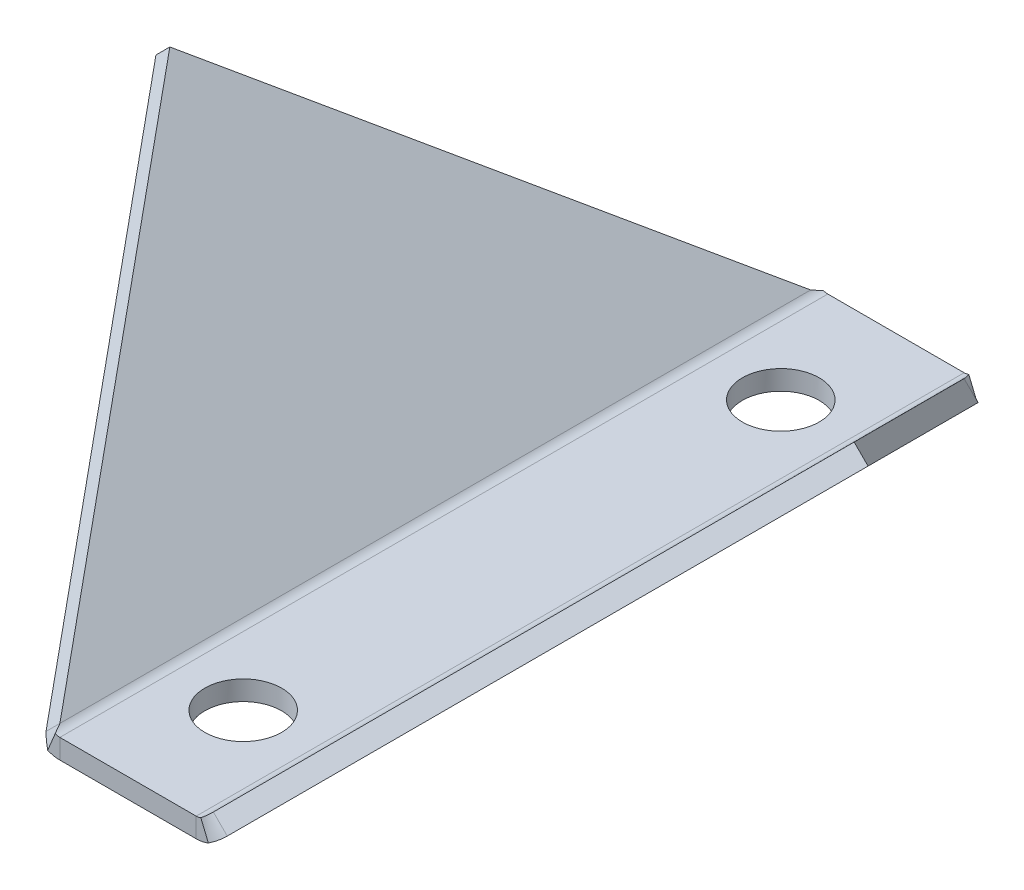
ISO-10303-21;
HEADER;
FILE_DESCRIPTION(('STEP AP214'),'2;1');
FILE_NAME('part.step','',(''),(''),'','','');
FILE_SCHEMA(('AUTOMOTIVE_DESIGN { 1 0 10303 214 1 1 1 1 }'));
ENDSEC;
DATA;
#1=APPLICATION_CONTEXT('core data for automotive mechanical design processes');
#2=APPLICATION_PROTOCOL_DEFINITION('international standard','automotive_design',2000,#1);
#3=PRODUCT_CONTEXT('',#1,'mechanical');
#4=PRODUCT('Part','Part','',(#3));
#5=PRODUCT_RELATED_PRODUCT_CATEGORY('part','',(#4));
#6=PRODUCT_DEFINITION_FORMATION('','',#4);
#7=PRODUCT_DEFINITION_CONTEXT('part definition',#1,'design');
#8=PRODUCT_DEFINITION('design','',#6,#7);
#9=PRODUCT_DEFINITION_SHAPE('','',#8);
#10=(LENGTH_UNIT() NAMED_UNIT(*) SI_UNIT(.MILLI.,.METRE.));
#11=(NAMED_UNIT(*) PLANE_ANGLE_UNIT() SI_UNIT($,.RADIAN.));
#12=(NAMED_UNIT(*) SI_UNIT($,.STERADIAN.) SOLID_ANGLE_UNIT());
#13=UNCERTAINTY_MEASURE_WITH_UNIT(LENGTH_MEASURE(1.E-05),#10,'distance_accuracy_value','');
#14=(GEOMETRIC_REPRESENTATION_CONTEXT(3) GLOBAL_UNCERTAINTY_ASSIGNED_CONTEXT((#13)) GLOBAL_UNIT_ASSIGNED_CONTEXT((#10,
#11,#12)) REPRESENTATION_CONTEXT('',''));
#15=CARTESIAN_POINT('',(0.,0.,0.));
#16=DIRECTION('',(0.,0.,1.));
#17=DIRECTION('',(1.,0.,0.));
#18=AXIS2_PLACEMENT_3D('',#15,#16,#17);
#19=CARTESIAN_POINT('',(-6.35,-1.6256,-31.75));
#20=DIRECTION('',(0.,0.,-1.));
#21=DIRECTION('',(-1.,0.,0.));
#22=AXIS2_PLACEMENT_3D('',#19,#20,#21);
#23=PLANE('',#22);
#24=DIRECTION('',(-1.,0.,0.));
#25=VECTOR('',#24,1.);
#26=CARTESIAN_POINT('',(-6.35,0.,-31.75));
#27=LINE('',#26,#25);
#28=CARTESIAN_POINT('',(5.63811510469655,0.,-31.75));
#29=VERTEX_POINT('',#28);
#30=CARTESIAN_POINT('',(-5.63811510469655,0.,-31.75));
#31=VERTEX_POINT('',#30);
#32=EDGE_CURVE('E103',#29,#31,#27,.T.);
#33=ORIENTED_EDGE('',*,*,#32,.F.);
#34=DIRECTION('',(0.,-1.,0.));
#35=VECTOR('',#34,1.);
#36=CARTESIAN_POINT('',(5.63811510469655,-1.6256,-31.75));
#37=LINE('',#36,#35);
#38=CARTESIAN_POINT('',(5.63811510469655,-1.6256,-31.75));
#39=VERTEX_POINT('',#38);
#40=EDGE_CURVE('E596',#29,#39,#37,.T.);
#41=ORIENTED_EDGE('',*,*,#40,.T.);
#42=DIRECTION('',(-1.,0.,0.));
#43=VECTOR('',#42,1.);
#44=CARTESIAN_POINT('',(-6.35,-1.6256,-31.75));
#45=LINE('',#44,#43);
#46=CARTESIAN_POINT('',(-5.63811510469655,-1.6256,-31.75));
#47=VERTEX_POINT('',#46);
#48=EDGE_CURVE('E655',#39,#47,#45,.T.);
#49=ORIENTED_EDGE('',*,*,#48,.T.);
#50=DIRECTION('',(0.,-1.,0.));
#51=VECTOR('',#50,1.);
#52=CARTESIAN_POINT('',(-5.63811510469655,-1.6256,-31.75));
#53=LINE('',#52,#51);
#54=EDGE_CURVE('E589',#31,#47,#53,.T.);
#55=ORIENTED_EDGE('',*,*,#54,.F.);
#56=EDGE_LOOP('',(#33,#41,#49,#55));
#57=FACE_BOUND('',#56,.T.);
#58=ADVANCED_FACE('F76',(#57),#23,.T.);
#59=CARTESIAN_POINT('',(-6.35,-1.6256,31.75));
#60=DIRECTION('',(0.,0.,1.));
#61=DIRECTION('',(1.,0.,0.));
#62=AXIS2_PLACEMENT_3D('',#59,#60,#61);
#63=PLANE('',#62);
#64=DIRECTION('',(1.,0.,0.));
#65=VECTOR('',#64,1.);
#66=CARTESIAN_POINT('',(-6.35,-1.6256,31.75));
#67=LINE('',#66,#65);
#68=CARTESIAN_POINT('',(-5.63811510469655,-1.6256,31.75));
#69=VERTEX_POINT('',#68);
#70=CARTESIAN_POINT('',(5.63811510469655,-1.6256,31.75));
#71=VERTEX_POINT('',#70);
#72=EDGE_CURVE('E651',#69,#71,#67,.T.);
#73=ORIENTED_EDGE('',*,*,#72,.T.);
#74=DIRECTION('',(0.,1.,0.));
#75=VECTOR('',#74,1.);
#76=CARTESIAN_POINT('',(5.63811510469655,-1.6256,31.75));
#77=LINE('',#76,#75);
#78=CARTESIAN_POINT('',(5.63811510469655,0.,31.75));
#79=VERTEX_POINT('',#78);
#80=EDGE_CURVE('E12',#71,#79,#77,.T.);
#81=ORIENTED_EDGE('',*,*,#80,.T.);
#82=DIRECTION('',(1.,0.,0.));
#83=VECTOR('',#82,1.);
#84=CARTESIAN_POINT('',(-6.35,0.,31.75));
#85=LINE('',#84,#83);
#86=CARTESIAN_POINT('',(-5.63811510469655,0.,31.75));
#87=VERTEX_POINT('',#86);
#88=EDGE_CURVE('E644',#87,#79,#85,.T.);
#89=ORIENTED_EDGE('',*,*,#88,.F.);
#90=DIRECTION('',(0.,1.,0.));
#91=VECTOR('',#90,1.);
#92=CARTESIAN_POINT('',(-5.63811510469655,-1.6256,31.75));
#93=LINE('',#92,#91);
#94=EDGE_CURVE('E598',#69,#87,#93,.T.);
#95=ORIENTED_EDGE('',*,*,#94,.F.);
#96=EDGE_LOOP('',(#73,#81,#89,#95));
#97=FACE_BOUND('',#96,.T.);
#98=ADVANCED_FACE('F637',(#97),#63,.T.);
#99=CARTESIAN_POINT('',(0.,-1.6256,0.));
#100=DIRECTION('',(0.,-1.,0.));
#101=DIRECTION('',(0.,0.,-1.));
#102=AXIS2_PLACEMENT_3D('',#99,#100,#101);
#103=PLANE('',#102);
#104=CARTESIAN_POINT('',(0.,-1.6256,-22.225));
#105=DIRECTION('',(0.,-1.,0.));
#106=DIRECTION('',(0.,0.,-1.));
#107=AXIS2_PLACEMENT_3D('',#104,#105,#106);
#108=CIRCLE('',#107,3.175);
#109=CARTESIAN_POINT('',(0.,-1.6256,-25.4));
#110=VERTEX_POINT('',#109);
#111=EDGE_CURVE('E659',#110,#110,#108,.T.);
#112=ORIENTED_EDGE('',*,*,#111,.F.);
#113=EDGE_LOOP('',(#112));
#114=FACE_BOUND('',#113,.T.);
#115=CARTESIAN_POINT('',(0.,-1.6256,22.225));
#116=DIRECTION('',(0.,-1.,0.));
#117=DIRECTION('',(0.,0.,-1.));
#118=AXIS2_PLACEMENT_3D('',#115,#116,#117);
#119=CIRCLE('',#118,3.175);
#120=CARTESIAN_POINT('',(0.,-1.6256,19.05));
#121=VERTEX_POINT('',#120);
#122=EDGE_CURVE('E661',#121,#121,#119,.T.);
#123=ORIENTED_EDGE('',*,*,#122,.F.);
#124=EDGE_LOOP('',(#123));
#125=FACE_BOUND('',#124,.T.);
#126=ORIENTED_EDGE('',*,*,#48,.F.);
#127=DIRECTION('',(0.,0.,1.));
#128=VECTOR('',#127,1.);
#129=CARTESIAN_POINT('',(5.63811510469655,-1.6256,0.));
#130=LINE('',#129,#128);
#131=EDGE_CURVE('E592',#39,#71,#130,.T.);
#132=ORIENTED_EDGE('',*,*,#131,.T.);
#133=ORIENTED_EDGE('',*,*,#72,.F.);
#134=DIRECTION('',(0.,0.,1.));
#135=VECTOR('',#134,1.);
#136=CARTESIAN_POINT('',(-5.63811510469655,-1.6256,0.));
#137=LINE('',#136,#135);
#138=EDGE_CURVE('E654',#47,#69,#137,.T.);
#139=ORIENTED_EDGE('',*,*,#138,.F.);
#140=EDGE_LOOP('',(#126,#132,#133,#139));
#141=FACE_BOUND('',#140,.T.);
#142=ADVANCED_FACE('F641',(#114,#125,#141),#103,.T.);
#143=CARTESIAN_POINT('',(0.,0.,0.));
#144=DIRECTION('',(0.,-1.,0.));
#145=DIRECTION('',(0.,0.,-1.));
#146=AXIS2_PLACEMENT_3D('',#143,#144,#145);
#147=PLANE('',#146);
#148=CARTESIAN_POINT('',(0.,0.,-22.225));
#149=DIRECTION('',(0.,1.,0.));
#150=DIRECTION('',(0.,0.,1.));
#151=AXIS2_PLACEMENT_3D('',#148,#149,#150);
#152=CIRCLE('',#151,3.175);
#153=CARTESIAN_POINT('',(0.,0.,-19.05));
#154=VERTEX_POINT('',#153);
#155=EDGE_CURVE('E665',#154,#154,#152,.T.);
#156=ORIENTED_EDGE('',*,*,#155,.F.);
#157=EDGE_LOOP('',(#156));
#158=FACE_BOUND('',#157,.T.);
#159=CARTESIAN_POINT('',(0.,0.,22.225));
#160=DIRECTION('',(0.,1.,0.));
#161=DIRECTION('',(0.,0.,1.));
#162=AXIS2_PLACEMENT_3D('',#159,#160,#161);
#163=CIRCLE('',#162,3.175);
#164=CARTESIAN_POINT('',(0.,0.,25.4));
#165=VERTEX_POINT('',#164);
#166=EDGE_CURVE('E668',#165,#165,#163,.T.);
#167=ORIENTED_EDGE('',*,*,#166,.F.);
#168=EDGE_LOOP('',(#167));
#169=FACE_BOUND('',#168,.T.);
#170=DIRECTION('',(0.,0.,1.));
#171=VECTOR('',#170,1.);
#172=CARTESIAN_POINT('',(5.63811510469655,0.,0.));
#173=LINE('',#172,#171);
#174=EDGE_CURVE('E87',#29,#79,#173,.T.);
#175=ORIENTED_EDGE('',*,*,#174,.F.);
#176=ORIENTED_EDGE('',*,*,#32,.T.);
#177=DIRECTION('',(0.,0.,1.));
#178=VECTOR('',#177,1.);
#179=CARTESIAN_POINT('',(-5.63811510469655,0.,0.));
#180=LINE('',#179,#178);
#181=EDGE_CURVE('E593',#31,#87,#180,.T.);
#182=ORIENTED_EDGE('',*,*,#181,.T.);
#183=ORIENTED_EDGE('',*,*,#88,.T.);
#184=EDGE_LOOP('',(#175,#176,#182,#183));
#185=FACE_BOUND('',#184,.T.);
#186=ADVANCED_FACE('F78',(#158,#169,#185),#147,.F.);
#187=CARTESIAN_POINT('',(-7.49469466937995,-0.856579564683395,-31.0381151046966));
#188=CARTESIAN_POINT('',(-7.25156582337249,-1.09970841069086,-31.2755107867488));
#189=CARTESIAN_POINT('',(-6.96055187060082,-1.29415771726935,-31.5126043179477));
#190=CARTESIAN_POINT('',(-6.64288872471433,-1.42573810056163,-31.75));
#191=CARTESIAN_POINT('',(-6.3452218858831,0.292893218813454,-31.0381151046966));
#192=CARTESIAN_POINT('',(-6.25264698032327,0.200318313253629,-31.2754481260505));
#193=CARTESIAN_POINT('',(-6.14175348014304,0.126221645349094,-31.5126669786461));
#194=CARTESIAN_POINT('',(-6.02079853706164,0.0761204674887134,-31.75));
#195=B_SPLINE_SURFACE_WITH_KNOTS('',1,3,((#187,#188,#189,#190),(#191,#192,#193,#194)),
.UNSPECIFIED.,.F.,.F.,.F.,(2,2),(4,4),(0.,1.),(0.,1.),.UNSPECIFIED.);
#196=CARTESIAN_POINT('',(-7.49469466937995,-0.856579564683395,-31.0381151046966));
#197=CARTESIAN_POINT('',(-6.3452218858831,0.292893218813454,-31.0381151046966));
#198=B_SPLINE_CURVE_WITH_KNOTS('',1,(#196,#197),.UNSPECIFIED.,.F.,.F.,(2,2),(0.,1.),.UNSPECIFIED.);
#199=CARTESIAN_POINT('',(-6.3452218858831,0.292893218813453,-31.0381151046966));
#200=VERTEX_POINT('',#199);
#201=CARTESIAN_POINT('',(-7.49469466937995,-0.856579564683395,-31.0381151046966));
#202=VERTEX_POINT('',#201);
#203=EDGE_CURVE('E544',#200,#202,#198,.F.);
#204=CARTESIAN_POINT('',(-6.3452218858831,0.292893218813454,-31.0381151046966));
#205=CARTESIAN_POINT('',(-6.25264698032327,0.200318313253629,-31.2754481260505));
#206=CARTESIAN_POINT('',(-6.14175348014304,0.126221645349094,-31.5126669786461));
#207=CARTESIAN_POINT('',(-6.02079853706164,0.0761204674887134,-31.75));
#208=B_SPLINE_CURVE_WITH_KNOTS('',3,(#204,#205,#206,#207),.UNSPECIFIED.,.F.,.F.,(4,4),(0.,1.),.UNSPECIFIED.);
#209=CARTESIAN_POINT('',(-6.02079853706164,0.0761204674887134,-31.75));
#210=VERTEX_POINT('',#209);
#211=EDGE_CURVE('E387',#200,#210,#208,.T.);
#212=CARTESIAN_POINT('',(-6.02079853706164,0.0761204674887134,-31.75));
#213=CARTESIAN_POINT('',(-6.64288872471433,-1.42573810056163,-31.75));
#214=B_SPLINE_CURVE_WITH_KNOTS('',1,(#212,#213),.UNSPECIFIED.,.F.,.F.,(2,2),(0.,1.),.UNSPECIFIED.);
#215=CARTESIAN_POINT('',(-6.64288872471433,-1.42573810056163,-31.75));
#216=VERTEX_POINT('',#215);
#217=EDGE_CURVE('E588',#210,#216,#214,.T.);
#218=CARTESIAN_POINT('',(-6.64288872471433,-1.42573810056163,-31.75));
#219=CARTESIAN_POINT('',(-6.96055187060082,-1.29415771726935,-31.5126043179477));
#220=CARTESIAN_POINT('',(-7.25156582337249,-1.09970841069086,-31.2755107867488));
#221=CARTESIAN_POINT('',(-7.49469466937995,-0.856579564683395,-31.0381151046966));
#222=B_SPLINE_CURVE_WITH_KNOTS('',3,(#218,#219,#220,#221),.UNSPECIFIED.,.F.,.F.,(4,4),(0.,1.),.UNSPECIFIED.);
#223=EDGE_CURVE('E554',#202,#216,#222,.F.);
#224=ORIENTED_EDGE('',*,*,#203,.F.);
#225=ORIENTED_EDGE('',*,*,#211,.T.);
#226=ORIENTED_EDGE('',*,*,#217,.T.);
#227=ORIENTED_EDGE('',*,*,#223,.F.);
#228=EDGE_LOOP('',(#224,#225,#226,#227));
#229=FACE_BOUND('',#228,.T.);
#230=ADVANCED_FACE('F482',(#229),#195,.T.);
#231=CARTESIAN_POINT('',(-5.63811510469655,1.,-31.75));
#232=DIRECTION('',(0.,0.,-1.));
#233=DIRECTION('',(-1.,0.,0.));
#234=AXIS2_PLACEMENT_3D('',#231,#232,#233);
#235=PLANE('',#234);
#236=ORIENTED_EDGE('',*,*,#217,.F.);
#237=CARTESIAN_POINT('',(-5.63811510469655,1.,-31.75));
#238=DIRECTION('',(0.,0.,-1.));
#239=DIRECTION('',(-1.,0.,0.));
#240=AXIS2_PLACEMENT_3D('',#237,#238,#239);
#241=CIRCLE('',#240,1.);
#242=EDGE_CURVE('E389',#210,#31,#241,.F.);
#243=ORIENTED_EDGE('',*,*,#242,.T.);
#244=ORIENTED_EDGE('',*,*,#54,.T.);
#245=CARTESIAN_POINT('',(-5.63811510469655,1.,-31.75));
#246=DIRECTION('',(0.,0.,1.));
#247=DIRECTION('',(-1.,0.,0.));
#248=AXIS2_PLACEMENT_3D('',#245,#246,#247);
#249=CIRCLE('',#248,2.6256);
#250=EDGE_CURVE('E399',#216,#47,#249,.T.);
#251=ORIENTED_EDGE('',*,*,#250,.F.);
#252=EDGE_LOOP('',(#236,#243,#244,#251));
#253=FACE_BOUND('',#252,.T.);
#254=ADVANCED_FACE('F525',(#253),#235,.T.);
#255=CARTESIAN_POINT('',(-5.63811510469655,1.,31.75));
#256=DIRECTION('',(0.,0.,1.));
#257=DIRECTION('',(1.,0.,0.));
#258=AXIS2_PLACEMENT_3D('',#255,#256,#257);
#259=PLANE('',#258);
#260=ORIENTED_EDGE('',*,*,#94,.T.);
#261=CARTESIAN_POINT('',(-5.63811510469655,1.,31.75));
#262=DIRECTION('',(0.,0.,-1.));
#263=DIRECTION('',(-1.,0.,0.));
#264=AXIS2_PLACEMENT_3D('',#261,#262,#263);
#265=CIRCLE('',#264,1.);
#266=CARTESIAN_POINT('',(-6.02079853706164,0.0761204674887134,31.75));
#267=VERTEX_POINT('',#266);
#268=EDGE_CURVE('E392',#87,#267,#265,.T.);
#269=ORIENTED_EDGE('',*,*,#268,.T.);
#270=CARTESIAN_POINT('',(-6.64288872471433,-1.42573810056163,31.75));
#271=CARTESIAN_POINT('',(-6.02079853706164,0.0761204674887134,31.75));
#272=B_SPLINE_CURVE_WITH_KNOTS('',1,(#270,#271),.UNSPECIFIED.,.F.,.F.,(2,2),(0.,1.),.UNSPECIFIED.);
#273=CARTESIAN_POINT('',(-6.64288872471433,-1.42573810056163,31.75));
#274=VERTEX_POINT('',#273);
#275=EDGE_CURVE('E514',#267,#274,#272,.F.);
#276=ORIENTED_EDGE('',*,*,#275,.T.);
#277=CARTESIAN_POINT('',(-5.63811510469655,1.,31.75));
#278=DIRECTION('',(0.,0.,-1.));
#279=DIRECTION('',(1.,0.,0.));
#280=AXIS2_PLACEMENT_3D('',#277,#278,#279);
#281=CIRCLE('',#280,2.6256);
#282=EDGE_CURVE('E440',#69,#274,#281,.T.);
#283=ORIENTED_EDGE('',*,*,#282,.F.);
#284=EDGE_LOOP('',(#260,#269,#276,#283));
#285=FACE_BOUND('',#284,.T.);
#286=ADVANCED_FACE('F481',(#285),#259,.T.);
#287=CARTESIAN_POINT('',(-6.64288872471433,-1.42573810056163,31.75));
#288=CARTESIAN_POINT('',(-6.96055187060082,-1.29415771726935,31.5126043179477));
#289=CARTESIAN_POINT('',(-7.25156582337247,-1.09970841069088,31.2755107867488));
#290=CARTESIAN_POINT('',(-7.49469466937994,-0.856579564683411,31.0381151046966));
#291=CARTESIAN_POINT('',(-6.02079853706164,0.0761204674887134,31.75));
#292=CARTESIAN_POINT('',(-6.14175348014302,0.126221645349088,31.5126669786461));
#293=CARTESIAN_POINT('',(-6.25264698032327,0.20031831325363,31.2754481260505));
#294=CARTESIAN_POINT('',(-6.34522188588309,0.292893218813448,31.0381151046966));
#295=B_SPLINE_SURFACE_WITH_KNOTS('',1,3,((#287,#288,#289,#290),(#291,#292,#293,#294)),
.UNSPECIFIED.,.F.,.F.,.F.,(2,2),(4,4),(0.,1.),(0.,1.),.UNSPECIFIED.);
#296=CARTESIAN_POINT('',(-6.02079853706164,0.0761204674887134,31.75));
#297=CARTESIAN_POINT('',(-6.14175348014302,0.126221645349088,31.5126669786461));
#298=CARTESIAN_POINT('',(-6.25264698032327,0.20031831325363,31.2754481260505));
#299=CARTESIAN_POINT('',(-6.34522188588309,0.292893218813448,31.0381151046966));
#300=B_SPLINE_CURVE_WITH_KNOTS('',3,(#296,#297,#298,#299),.UNSPECIFIED.,.F.,.F.,(4,4),(0.,1.),.UNSPECIFIED.);
#301=CARTESIAN_POINT('',(-6.3452218858831,0.292893218813453,31.0381151046965));
#302=VERTEX_POINT('',#301);
#303=EDGE_CURVE('E450',#267,#302,#300,.T.);
#304=CARTESIAN_POINT('',(-6.34522188588309,0.292893218813448,31.0381151046966));
#305=CARTESIAN_POINT('',(-7.49469466937994,-0.856579564683411,31.0381151046966));
#306=B_SPLINE_CURVE_WITH_KNOTS('',1,(#304,#305),.UNSPECIFIED.,.F.,.F.,(2,2),(0.,1.),.UNSPECIFIED.);
#307=CARTESIAN_POINT('',(-7.49469466937994,-0.856579564683407,31.0381151046966));
#308=VERTEX_POINT('',#307);
#309=EDGE_CURVE('E611',#308,#302,#306,.F.);
#310=CARTESIAN_POINT('',(-7.49469466937994,-0.856579564683411,31.0381151046966));
#311=CARTESIAN_POINT('',(-7.25156582337247,-1.09970841069088,31.2755107867488));
#312=CARTESIAN_POINT('',(-6.96055187060082,-1.29415771726935,31.5126043179477));
#313=CARTESIAN_POINT('',(-6.64288872471433,-1.42573810056163,31.75));
#314=B_SPLINE_CURVE_WITH_KNOTS('',3,(#310,#311,#312,#313),.UNSPECIFIED.,.F.,.F.,(4,4),(0.,1.),.UNSPECIFIED.);
#315=EDGE_CURVE('E439',#274,#308,#314,.F.);
#316=ORIENTED_EDGE('',*,*,#303,.T.);
#317=ORIENTED_EDGE('',*,*,#309,.F.);
#318=ORIENTED_EDGE('',*,*,#315,.F.);
#319=ORIENTED_EDGE('',*,*,#275,.F.);
#320=EDGE_LOOP('',(#316,#317,#318,#319));
#321=FACE_BOUND('',#320,.T.);
#322=ADVANCED_FACE('F413',(#321),#295,.T.);
#323=CARTESIAN_POINT('',(-5.63811510469655,1.,63.5367586187448));
#324=DIRECTION('',(0.,0.,-1.));
#325=DIRECTION('',(-1.,0.,0.));
#326=AXIS2_PLACEMENT_3D('',#323,#324,#325);
#327=CYLINDRICAL_SURFACE('',#326,2.6256);
#328=ORIENTED_EDGE('',*,*,#282,.T.);
#329=ORIENTED_EDGE('',*,*,#315,.T.);
#330=DIRECTION('',(0.,0.,1.));
#331=VECTOR('',#330,1.);
#332=CARTESIAN_POINT('',(-7.49469466937995,-0.856579564683396,0.));
#333=LINE('',#332,#331);
#334=EDGE_CURVE('E585',#202,#308,#333,.T.);
#335=ORIENTED_EDGE('',*,*,#334,.F.);
#336=ORIENTED_EDGE('',*,*,#223,.T.);
#337=ORIENTED_EDGE('',*,*,#250,.T.);
#338=ORIENTED_EDGE('',*,*,#138,.T.);
#339=EDGE_LOOP('',(#328,#329,#335,#336,#337,#338));
#340=FACE_BOUND('',#339,.T.);
#341=ADVANCED_FACE('F402',(#340),#327,.T.);
#342=CARTESIAN_POINT('',(-5.63811510469655,1.,63.5367586187448));
#343=DIRECTION('',(0.,0.,-1.));
#344=DIRECTION('',(-1.,0.,0.));
#345=AXIS2_PLACEMENT_3D('',#342,#343,#344);
#346=CYLINDRICAL_SURFACE('',#345,1.);
#347=ORIENTED_EDGE('',*,*,#268,.F.);
#348=ORIENTED_EDGE('',*,*,#181,.F.);
#349=ORIENTED_EDGE('',*,*,#242,.F.);
#350=ORIENTED_EDGE('',*,*,#211,.F.);
#351=DIRECTION('',(0.,0.,1.));
#352=VECTOR('',#351,1.);
#353=CARTESIAN_POINT('',(-6.3452218858831,0.292893218813453,0.));
#354=LINE('',#353,#352);
#355=EDGE_CURVE('E563',#200,#302,#354,.T.);
#356=ORIENTED_EDGE('',*,*,#355,.T.);
#357=ORIENTED_EDGE('',*,*,#303,.F.);
#358=EDGE_LOOP('',(#347,#348,#349,#350,#356,#357));
#359=FACE_BOUND('',#358,.T.);
#360=ADVANCED_FACE('F412',(#359),#346,.F.);
#361=CARTESIAN_POINT('',(-2.50118797195204,-5.85008626211132,0.));
#362=DIRECTION('',(-0.707106781186549,-0.707106781186546,0.));
#363=DIRECTION('',(0.,0.,-1.));
#364=AXIS2_PLACEMENT_3D('',#361,#362,#363);
#365=PLANE('',#364);
#366=DIRECTION('',(-0.500000000000001,0.500000000000003,0.707106781186545));
#367=VECTOR('',#366,1.);
#368=CARTESIAN_POINT('',(-6.99131603248661,-1.35995820157674,-31.75));
#369=LINE('',#368,#367);
#370=CARTESIAN_POINT('',(-29.4419563351595,21.0906821010963,-1.11022302462516E-13));
#371=VERTEX_POINT('',#370);
#372=EDGE_CURVE('E388',#202,#371,#369,.T.);
#373=ORIENTED_EDGE('',*,*,#372,.F.);
#374=ORIENTED_EDGE('',*,*,#334,.T.);
#375=DIRECTION('',(0.499999999999999,-0.500000000000001,0.707106781186548));
#376=VECTOR('',#375,1.);
#377=CARTESIAN_POINT('',(-29.4419563351595,21.0906821010963,-1.11022302462516E-13));
#378=LINE('',#377,#376);
#379=EDGE_CURVE('E606',#371,#308,#378,.T.);
#380=ORIENTED_EDGE('',*,*,#379,.F.);
#381=EDGE_LOOP('',(#373,#374,#380));
#382=FACE_BOUND('',#381,.T.);
#383=ADVANCED_FACE('F372',(#382),#365,.T.);
#384=CARTESIAN_POINT('',(-29.4419563351595,21.0906821010963,-1.11022302462516E-13));
#385=DIRECTION('',(-0.499999999999999,0.500000000000001,0.707106781186548));
#386=DIRECTION('',(0.499999999999999,-0.500000000000001,0.707106781186548));
#387=AXIS2_PLACEMENT_3D('',#384,#385,#386);
#388=PLANE('',#387);
#389=ORIENTED_EDGE('',*,*,#379,.T.);
#390=ORIENTED_EDGE('',*,*,#309,.T.);
#391=DIRECTION('',(0.499999999999999,-0.500000000000001,0.707106781186548));
#392=VECTOR('',#391,1.);
#393=CARTESIAN_POINT('',(-28.2924835516627,22.2401548845931,-1.11022302462516E-13));
#394=LINE('',#393,#392);
#395=CARTESIAN_POINT('',(-28.2924835516627,22.2401548845931,-1.11022302462516E-13));
#396=VERTEX_POINT('',#395);
#397=EDGE_CURVE('E559',#396,#302,#394,.T.);
#398=ORIENTED_EDGE('',*,*,#397,.F.);
#399=DIRECTION('',(0.707106781186549,0.707106781186546,0.));
#400=VECTOR('',#399,1.);
#401=CARTESIAN_POINT('',(-29.4419563351595,21.0906821010963,-1.11022302462516E-13));
#402=LINE('',#401,#400);
#403=EDGE_CURVE('E379',#371,#396,#402,.T.);
#404=ORIENTED_EDGE('',*,*,#403,.F.);
#405=EDGE_LOOP('',(#389,#390,#398,#404));
#406=FACE_BOUND('',#405,.T.);
#407=ADVANCED_FACE('F622',(#406),#388,.T.);
#408=CARTESIAN_POINT('',(-1.35171518845519,-4.70061347861448,0.));
#409=DIRECTION('',(-0.707106781186549,-0.707106781186546,0.));
#410=DIRECTION('',(0.,0.,-1.));
#411=AXIS2_PLACEMENT_3D('',#408,#409,#410);
#412=PLANE('',#411);
#413=ORIENTED_EDGE('',*,*,#355,.F.);
#414=DIRECTION('',(-0.500000000000001,0.500000000000003,0.707106781186545));
#415=VECTOR('',#414,1.);
#416=CARTESIAN_POINT('',(-5.84184324898975,-0.210485418079892,-31.75));
#417=LINE('',#416,#415);
#418=EDGE_CURVE('E1002',#200,#396,#417,.T.);
#419=ORIENTED_EDGE('',*,*,#418,.T.);
#420=ORIENTED_EDGE('',*,*,#397,.T.);
#421=EDGE_LOOP('',(#413,#419,#420));
#422=FACE_BOUND('',#421,.T.);
#423=ADVANCED_FACE('F630',(#422),#412,.F.);
#424=CARTESIAN_POINT('',(-6.99131603248661,-1.35995820157674,-31.75));
#425=DIRECTION('',(-0.499999999999997,0.499999999999999,-0.70710678118655));
#426=DIRECTION('',(-0.500000000000001,0.500000000000003,0.707106781186545));
#427=AXIS2_PLACEMENT_3D('',#424,#425,#426);
#428=PLANE('',#427);
#429=ORIENTED_EDGE('',*,*,#418,.F.);
#430=ORIENTED_EDGE('',*,*,#203,.T.);
#431=ORIENTED_EDGE('',*,*,#372,.T.);
#432=ORIENTED_EDGE('',*,*,#403,.T.);
#433=EDGE_LOOP('',(#429,#430,#431,#432));
#434=FACE_BOUND('',#433,.T.);
#435=ADVANCED_FACE('F368',(#434),#428,.T.);
#436=CARTESIAN_POINT('',(5.63811510469655,1.,-31.75));
#437=DIRECTION('',(0.,0.,-1.));
#438=DIRECTION('',(-1.,0.,0.));
#439=AXIS2_PLACEMENT_3D('',#436,#437,#438);
#440=PLANE('',#439);
#441=ORIENTED_EDGE('',*,*,#40,.F.);
#442=CARTESIAN_POINT('',(5.63811510469655,1.,-31.75));
#443=DIRECTION('',(0.,0.,1.));
#444=DIRECTION('',(1.,0.,0.));
#445=AXIS2_PLACEMENT_3D('',#442,#443,#444);
#446=CIRCLE('',#445,1.);
#447=CARTESIAN_POINT('',(6.02079853706164,0.0761204674887134,-31.75));
#448=VERTEX_POINT('',#447);
#449=EDGE_CURVE('E202',#29,#448,#446,.T.);
#450=ORIENTED_EDGE('',*,*,#449,.T.);
#451=CARTESIAN_POINT('',(6.64288872471433,-1.42573810056163,-31.75));
#452=CARTESIAN_POINT('',(6.02079853706164,0.0761204674887134,-31.75));
#453=B_SPLINE_CURVE_WITH_KNOTS('',1,(#451,#452),.UNSPECIFIED.,.F.,.F.,(2,2),(0.,1.),.UNSPECIFIED.);
#454=CARTESIAN_POINT('',(6.64288872471433,-1.42573810056163,-31.75));
#455=VERTEX_POINT('',#454);
#456=EDGE_CURVE('E353',#448,#455,#453,.F.);
#457=ORIENTED_EDGE('',*,*,#456,.T.);
#458=CARTESIAN_POINT('',(5.63811510469655,1.,-31.75));
#459=DIRECTION('',(0.,0.,1.));
#460=DIRECTION('',(-1.,0.,0.));
#461=AXIS2_PLACEMENT_3D('',#458,#459,#460);
#462=CIRCLE('',#461,2.6256);
#463=EDGE_CURVE('E290',#39,#455,#462,.T.);
#464=ORIENTED_EDGE('',*,*,#463,.F.);
#465=EDGE_LOOP('',(#441,#450,#457,#464));
#466=FACE_BOUND('',#465,.T.);
#467=ADVANCED_FACE('F359',(#466),#440,.T.);
#468=CARTESIAN_POINT('',(6.64288872471433,-1.42573810056163,-31.75));
#469=CARTESIAN_POINT('',(6.96055187060082,-1.29415771726935,-31.5126043179477));
#470=CARTESIAN_POINT('',(7.25156582337249,-1.09970841069086,-31.2755107867488));
#471=CARTESIAN_POINT('',(7.49469466937995,-0.856579564683396,-31.0381151046966));
#472=CARTESIAN_POINT('',(6.02079853706164,0.0761204674887134,-31.75));
#473=CARTESIAN_POINT('',(6.14175348014305,0.126221645349099,-31.5126669786461));
#474=CARTESIAN_POINT('',(6.25264698032326,0.200318313253614,-31.2754481260505));
#475=CARTESIAN_POINT('',(6.3452218858831,0.292893218813453,-31.0381151046966));
#476=B_SPLINE_SURFACE_WITH_KNOTS('',1,3,((#468,#469,#470,#471),(#472,#473,#474,#475)),
.UNSPECIFIED.,.F.,.F.,.F.,(2,2),(4,4),(0.,1.),(0.,1.),.UNSPECIFIED.);
#477=CARTESIAN_POINT('',(6.02079853706164,0.0761204674887134,-31.75));
#478=CARTESIAN_POINT('',(6.14175348014305,0.126221645349099,-31.5126669786461));
#479=CARTESIAN_POINT('',(6.25264698032326,0.200318313253614,-31.2754481260505));
#480=CARTESIAN_POINT('',(6.3452218858831,0.292893218813453,-31.0381151046966));
#481=B_SPLINE_CURVE_WITH_KNOTS('',3,(#477,#478,#479,#480),.UNSPECIFIED.,.F.,.F.,(4,4),(0.,1.),.UNSPECIFIED.);
#482=CARTESIAN_POINT('',(6.3452218858831,0.292893218813454,-31.0381151046966));
#483=VERTEX_POINT('',#482);
#484=EDGE_CURVE('E710',#448,#483,#481,.T.);
#485=CARTESIAN_POINT('',(6.3452218858831,0.292893218813453,-31.0381151046966));
#486=CARTESIAN_POINT('',(7.49469466937995,-0.856579564683396,-31.0381151046966));
#487=B_SPLINE_CURVE_WITH_KNOTS('',1,(#485,#486),.UNSPECIFIED.,.F.,.F.,(2,2),(0.,1.),.UNSPECIFIED.);
#488=CARTESIAN_POINT('',(7.49469466937996,-0.856579564683396,-31.0381151046966));
#489=VERTEX_POINT('',#488);
#490=EDGE_CURVE('E206',#483,#489,#487,.T.);
#491=CARTESIAN_POINT('',(7.49469466937995,-0.856579564683396,-31.0381151046966));
#492=CARTESIAN_POINT('',(7.25156582337249,-1.09970841069086,-31.2755107867488));
#493=CARTESIAN_POINT('',(6.96055187060082,-1.29415771726935,-31.5126043179477));
#494=CARTESIAN_POINT('',(6.64288872471433,-1.42573810056163,-31.75));
#495=B_SPLINE_CURVE_WITH_KNOTS('',3,(#491,#492,#493,#494),.UNSPECIFIED.,.F.,.F.,(4,4),(0.,1.),.UNSPECIFIED.);
#496=EDGE_CURVE('E702',#455,#489,#495,.F.);
#497=ORIENTED_EDGE('',*,*,#456,.F.);
#498=ORIENTED_EDGE('',*,*,#484,.T.);
#499=ORIENTED_EDGE('',*,*,#490,.T.);
#500=ORIENTED_EDGE('',*,*,#496,.F.);
#501=EDGE_LOOP('',(#497,#498,#499,#500));
#502=FACE_BOUND('',#501,.T.);
#503=ADVANCED_FACE('F309',(#502),#476,.T.);
#504=CARTESIAN_POINT('',(7.49469466937995,-0.856579564683396,31.0381151046965));
#505=CARTESIAN_POINT('',(7.2515658233725,-1.09970841069085,31.2755107867488));
#506=CARTESIAN_POINT('',(6.96055187060081,-1.29415771726935,31.5126043179477));
#507=CARTESIAN_POINT('',(6.64288872471433,-1.42573810056163,31.75));
#508=CARTESIAN_POINT('',(6.3452218858831,0.292893218813453,31.0381151046965));
#509=CARTESIAN_POINT('',(6.25264698032328,0.20031831325363,31.2754481260505));
#510=CARTESIAN_POINT('',(6.14175348014304,0.126221645349093,31.5126669786461));
#511=CARTESIAN_POINT('',(6.02079853706164,0.0761204674887134,31.75));
#512=B_SPLINE_SURFACE_WITH_KNOTS('',1,3,((#504,#505,#506,#507),(#508,#509,#510,#511)),
.UNSPECIFIED.,.F.,.F.,.F.,(2,2),(4,4),(0.,1.),(0.,1.),.UNSPECIFIED.);
#513=CARTESIAN_POINT('',(7.49469466937995,-0.856579564683396,31.0381151046965));
#514=CARTESIAN_POINT('',(6.3452218858831,0.292893218813453,31.0381151046965));
#515=B_SPLINE_CURVE_WITH_KNOTS('',1,(#513,#514),.UNSPECIFIED.,.F.,.F.,(2,2),(0.,1.),.UNSPECIFIED.);
#516=CARTESIAN_POINT('',(7.49469466937996,-0.856579564683396,31.0381151046965));
#517=VERTEX_POINT('',#516);
#518=CARTESIAN_POINT('',(6.3452218858831,0.292893218813449,31.0381151046966));
#519=VERTEX_POINT('',#518);
#520=EDGE_CURVE('E189',#517,#519,#515,.T.);
#521=CARTESIAN_POINT('',(6.3452218858831,0.292893218813453,31.0381151046965));
#522=CARTESIAN_POINT('',(6.25264698032328,0.20031831325363,31.2754481260505));
#523=CARTESIAN_POINT('',(6.14175348014304,0.126221645349093,31.5126669786461));
#524=CARTESIAN_POINT('',(6.02079853706164,0.0761204674887134,31.75));
#525=B_SPLINE_CURVE_WITH_KNOTS('',3,(#521,#522,#523,#524),.UNSPECIFIED.,.F.,.F.,(4,4),(0.,1.),.UNSPECIFIED.);
#526=CARTESIAN_POINT('',(6.02079853706164,0.0761204674887134,31.75));
#527=VERTEX_POINT('',#526);
#528=EDGE_CURVE('E280',#519,#527,#525,.T.);
#529=CARTESIAN_POINT('',(6.02079853706164,0.0761204674887134,31.75));
#530=CARTESIAN_POINT('',(6.64288872471433,-1.42573810056163,31.75));
#531=B_SPLINE_CURVE_WITH_KNOTS('',1,(#529,#530),.UNSPECIFIED.,.F.,.F.,(2,2),(0.,1.),.UNSPECIFIED.);
#532=CARTESIAN_POINT('',(6.64288872471433,-1.42573810056163,31.75));
#533=VERTEX_POINT('',#532);
#534=EDGE_CURVE('E273',#527,#533,#531,.T.);
#535=CARTESIAN_POINT('',(6.64288872471433,-1.42573810056163,31.75));
#536=CARTESIAN_POINT('',(6.96055187060081,-1.29415771726935,31.5126043179477));
#537=CARTESIAN_POINT('',(7.2515658233725,-1.09970841069085,31.2755107867488));
#538=CARTESIAN_POINT('',(7.49469466937995,-0.856579564683396,31.0381151046965));
#539=B_SPLINE_CURVE_WITH_KNOTS('',3,(#535,#536,#537,#538),.UNSPECIFIED.,.F.,.F.,(4,4),(0.,1.),.UNSPECIFIED.);
#540=EDGE_CURVE('E269',#517,#533,#539,.F.);
#541=ORIENTED_EDGE('',*,*,#520,.T.);
#542=ORIENTED_EDGE('',*,*,#528,.T.);
#543=ORIENTED_EDGE('',*,*,#534,.T.);
#544=ORIENTED_EDGE('',*,*,#540,.F.);
#545=EDGE_LOOP('',(#541,#542,#543,#544));
#546=FACE_BOUND('',#545,.T.);
#547=ADVANCED_FACE('F298',(#546),#512,.T.);
#548=CARTESIAN_POINT('',(5.63811510469655,1.,31.75));
#549=DIRECTION('',(0.,0.,1.));
#550=DIRECTION('',(1.,0.,0.));
#551=AXIS2_PLACEMENT_3D('',#548,#549,#550);
#552=PLANE('',#551);
#553=CARTESIAN_POINT('',(5.63811510469655,1.,31.75));
#554=DIRECTION('',(0.,0.,1.));
#555=DIRECTION('',(1.,0.,0.));
#556=AXIS2_PLACEMENT_3D('',#553,#554,#555);
#557=CIRCLE('',#556,1.);
#558=EDGE_CURVE('E95',#527,#79,#557,.F.);
#559=ORIENTED_EDGE('',*,*,#558,.T.);
#560=ORIENTED_EDGE('',*,*,#80,.F.);
#561=CARTESIAN_POINT('',(5.63811510469655,1.,31.75));
#562=DIRECTION('',(0.,0.,-1.));
#563=DIRECTION('',(1.,0.,0.));
#564=AXIS2_PLACEMENT_3D('',#561,#562,#563);
#565=CIRCLE('',#564,2.6256);
#566=EDGE_CURVE('E271',#533,#71,#565,.T.);
#567=ORIENTED_EDGE('',*,*,#566,.F.);
#568=ORIENTED_EDGE('',*,*,#534,.F.);
#569=EDGE_LOOP('',(#559,#560,#567,#568));
#570=FACE_BOUND('',#569,.T.);
#571=ADVANCED_FACE('F245',(#570),#552,.T.);
#572=CARTESIAN_POINT('',(5.63811510469655,1.,-63.5367586187448));
#573=DIRECTION('',(0.,0.,1.));
#574=DIRECTION('',(1.,0.,0.));
#575=AXIS2_PLACEMENT_3D('',#572,#573,#574);
#576=CYLINDRICAL_SURFACE('',#575,2.6256);
#577=ORIENTED_EDGE('',*,*,#540,.T.);
#578=ORIENTED_EDGE('',*,*,#566,.T.);
#579=ORIENTED_EDGE('',*,*,#131,.F.);
#580=ORIENTED_EDGE('',*,*,#463,.T.);
#581=ORIENTED_EDGE('',*,*,#496,.T.);
#582=DIRECTION('',(0.,0.,1.));
#583=VECTOR('',#582,1.);
#584=CARTESIAN_POINT('',(7.49469466937996,-0.856579564683396,0.));
#585=LINE('',#584,#583);
#586=EDGE_CURVE('E205',#489,#517,#585,.T.);
#587=ORIENTED_EDGE('',*,*,#586,.T.);
#588=EDGE_LOOP('',(#577,#578,#579,#580,#581,#587));
#589=FACE_BOUND('',#588,.T.);
#590=ADVANCED_FACE('F240',(#589),#576,.T.);
#591=CARTESIAN_POINT('',(5.63811510469655,1.,-63.5367586187448));
#592=DIRECTION('',(0.,0.,1.));
#593=DIRECTION('',(1.,0.,0.));
#594=AXIS2_PLACEMENT_3D('',#591,#592,#593);
#595=CYLINDRICAL_SURFACE('',#594,1.);
#596=ORIENTED_EDGE('',*,*,#528,.F.);
#597=DIRECTION('',(0.,0.,1.));
#598=VECTOR('',#597,1.);
#599=CARTESIAN_POINT('',(6.3452218858831,0.292893218813453,0.));
#600=LINE('',#599,#598);
#601=EDGE_CURVE('E208',#483,#519,#600,.T.);
#602=ORIENTED_EDGE('',*,*,#601,.F.);
#603=ORIENTED_EDGE('',*,*,#484,.F.);
#604=ORIENTED_EDGE('',*,*,#449,.F.);
#605=ORIENTED_EDGE('',*,*,#174,.T.);
#606=ORIENTED_EDGE('',*,*,#558,.F.);
#607=EDGE_LOOP('',(#596,#602,#603,#604,#605,#606));
#608=FACE_BOUND('',#607,.T.);
#609=ADVANCED_FACE('F244',(#608),#595,.F.);
#610=CARTESIAN_POINT('',(2.50118797195204,-5.85008626211133,0.));
#611=DIRECTION('',(0.707106781186549,-0.707106781186546,0.));
#612=DIRECTION('',(0.,0.,-1.));
#613=AXIS2_PLACEMENT_3D('',#610,#611,#612);
#614=PLANE('',#613);
#615=ORIENTED_EDGE('',*,*,#586,.F.);
#616=DIRECTION('',(-0.500000000000001,-0.500000000000003,-0.707106781186545));
#617=VECTOR('',#616,1.);
#618=CARTESIAN_POINT('',(6.99131603248661,-1.35995820157674,-31.75));
#619=LINE('',#618,#617);
#620=CARTESIAN_POINT('',(29.4419563351595,21.0906821010963,-1.11022302462516E-13));
#621=VERTEX_POINT('',#620);
#622=EDGE_CURVE('E199',#621,#489,#619,.T.);
#623=ORIENTED_EDGE('',*,*,#622,.F.);
#624=DIRECTION('',(0.499999999999999,0.500000000000001,-0.707106781186548));
#625=VECTOR('',#624,1.);
#626=CARTESIAN_POINT('',(29.4419563351595,21.0906821010963,-1.11022302462516E-13));
#627=LINE('',#626,#625);
#628=EDGE_CURVE('E183',#517,#621,#627,.T.);
#629=ORIENTED_EDGE('',*,*,#628,.F.);
#630=EDGE_LOOP('',(#615,#623,#629));
#631=FACE_BOUND('',#630,.T.);
#632=ADVANCED_FACE('F204',(#631),#614,.T.);
#633=CARTESIAN_POINT('',(6.99131603248661,-1.35995820157674,-31.75));
#634=DIRECTION('',(0.499999999999997,0.499999999999999,-0.70710678118655));
#635=DIRECTION('',(-0.500000000000001,-0.500000000000003,-0.707106781186545));
#636=AXIS2_PLACEMENT_3D('',#633,#634,#635);
#637=PLANE('',#636);
#638=ORIENTED_EDGE('',*,*,#490,.F.);
#639=DIRECTION('',(-0.500000000000001,-0.500000000000003,-0.707106781186545));
#640=VECTOR('',#639,1.);
#641=CARTESIAN_POINT('',(5.84184324898976,-0.210485418079892,-31.75));
#642=LINE('',#641,#640);
#643=CARTESIAN_POINT('',(28.2924835516627,22.2401548845931,-1.11022302462516E-13));
#644=VERTEX_POINT('',#643);
#645=EDGE_CURVE('E201',#644,#483,#642,.T.);
#646=ORIENTED_EDGE('',*,*,#645,.F.);
#647=DIRECTION('',(-0.707106781186549,0.707106781186546,0.));
#648=VECTOR('',#647,1.);
#649=CARTESIAN_POINT('',(29.4419563351595,21.0906821010963,-1.11022302462516E-13));
#650=LINE('',#649,#648);
#651=EDGE_CURVE('E186',#621,#644,#650,.T.);
#652=ORIENTED_EDGE('',*,*,#651,.F.);
#653=ORIENTED_EDGE('',*,*,#622,.T.);
#654=EDGE_LOOP('',(#638,#646,#652,#653));
#655=FACE_BOUND('',#654,.T.);
#656=ADVANCED_FACE('F198',(#655),#637,.T.);
#657=CARTESIAN_POINT('',(1.35171518845519,-4.70061347861448,0.));
#658=DIRECTION('',(0.707106781186549,-0.707106781186546,0.));
#659=DIRECTION('',(0.,0.,-1.));
#660=AXIS2_PLACEMENT_3D('',#657,#658,#659);
#661=PLANE('',#660);
#662=ORIENTED_EDGE('',*,*,#645,.T.);
#663=ORIENTED_EDGE('',*,*,#601,.T.);
#664=DIRECTION('',(0.499999999999999,0.500000000000001,-0.707106781186548));
#665=VECTOR('',#664,1.);
#666=CARTESIAN_POINT('',(28.2924835516627,22.2401548845931,-1.11022302462516E-13));
#667=LINE('',#666,#665);
#668=EDGE_CURVE('E193',#519,#644,#667,.T.);
#669=ORIENTED_EDGE('',*,*,#668,.T.);
#670=EDGE_LOOP('',(#662,#663,#669));
#671=FACE_BOUND('',#670,.T.);
#672=ADVANCED_FACE('F232',(#671),#661,.F.);
#673=CARTESIAN_POINT('',(29.4419563351595,21.0906821010963,-1.11022302462516E-13));
#674=DIRECTION('',(0.499999999999999,0.500000000000001,0.707106781186547));
#675=DIRECTION('',(0.499999999999999,0.500000000000001,-0.707106781186548));
#676=AXIS2_PLACEMENT_3D('',#673,#674,#675);
#677=PLANE('',#676);
#678=ORIENTED_EDGE('',*,*,#520,.F.);
#679=ORIENTED_EDGE('',*,*,#628,.T.);
#680=ORIENTED_EDGE('',*,*,#651,.T.);
#681=ORIENTED_EDGE('',*,*,#668,.F.);
#682=EDGE_LOOP('',(#678,#679,#680,#681));
#683=FACE_BOUND('',#682,.T.);
#684=ADVANCED_FACE('F185',(#683),#677,.T.);
#685=CARTESIAN_POINT('',(0.,-2.54,22.225));
#686=DIRECTION('',(0.,1.,0.));
#687=DIRECTION('',(0.,0.,1.));
#688=AXIS2_PLACEMENT_3D('',#685,#686,#687);
#689=CYLINDRICAL_SURFACE('',#688,3.175);
#690=ORIENTED_EDGE('',*,*,#122,.T.);
#691=EDGE_LOOP('',(#690));
#692=FACE_BOUND('',#691,.T.);
#693=ORIENTED_EDGE('',*,*,#166,.T.);
#694=EDGE_LOOP('',(#693));
#695=FACE_BOUND('',#694,.T.);
#696=ADVANCED_FACE('F239',(#692,#695),#689,.F.);
#697=CARTESIAN_POINT('',(0.,-2.54,-22.225));
#698=DIRECTION('',(0.,1.,0.));
#699=DIRECTION('',(0.,0.,1.));
#700=AXIS2_PLACEMENT_3D('',#697,#698,#699);
#701=CYLINDRICAL_SURFACE('',#700,3.175);
#702=ORIENTED_EDGE('',*,*,#111,.T.);
#703=EDGE_LOOP('',(#702));
#704=FACE_BOUND('',#703,.T.);
#705=ORIENTED_EDGE('',*,*,#155,.T.);
#706=EDGE_LOOP('',(#705));
#707=FACE_BOUND('',#706,.T.);
#708=ADVANCED_FACE('F674',(#704,#707),#701,.F.);
#709=CLOSED_SHELL('',(#58,#98,#142,#186,#230,#254,#286,#322,#341,#360,#383,#407,#423,#435,#467,
#503,#547,#571,#590,#609,#632,#656,#672,#684,#696,#708));
#710=MANIFOLD_SOLID_BREP('B2',#709);
#711=ADVANCED_BREP_SHAPE_REPRESENTATION('',(#18,#710),#14);
#712=SHAPE_DEFINITION_REPRESENTATION(#9,#711);
ENDSEC;
END-ISO-10303-21;
